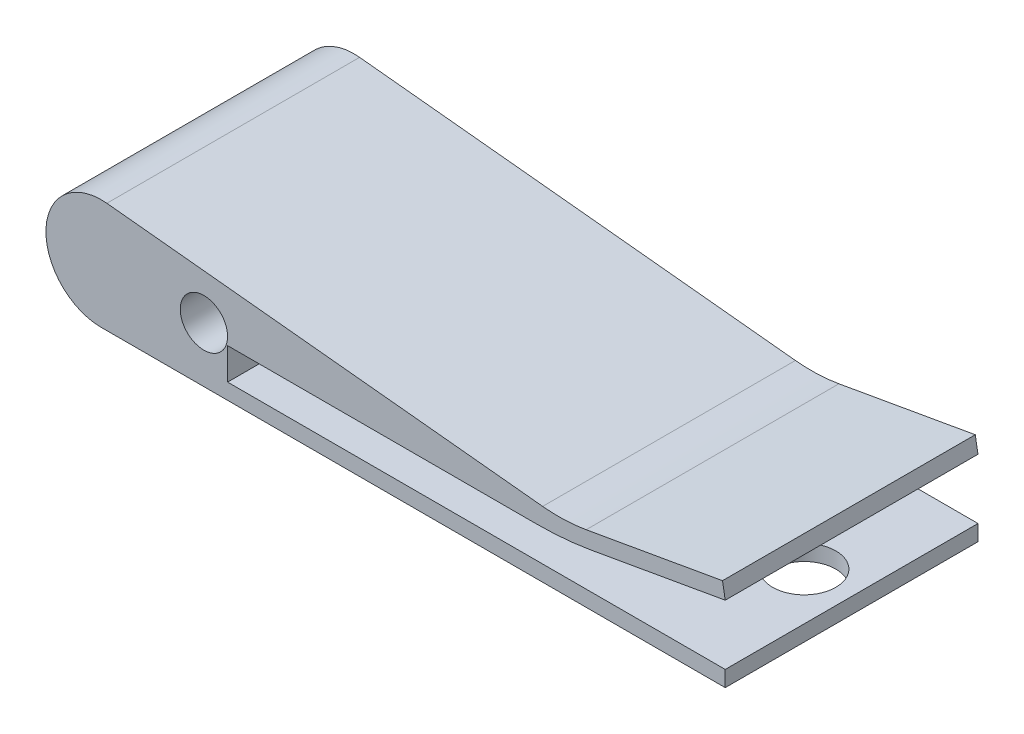
ISO-10303-21;
HEADER;
FILE_DESCRIPTION(('STEP AP214'),'2;1');
FILE_NAME('part.step','',(''),(''),'','','');
FILE_SCHEMA(('AUTOMOTIVE_DESIGN { 1 0 10303 214 1 1 1 1 }'));
ENDSEC;
DATA;
#1=APPLICATION_CONTEXT('core data for automotive mechanical design processes');
#2=APPLICATION_PROTOCOL_DEFINITION('international standard','automotive_design',2000,#1);
#3=PRODUCT_CONTEXT('',#1,'mechanical');
#4=PRODUCT('Part','Part','',(#3));
#5=PRODUCT_RELATED_PRODUCT_CATEGORY('part','',(#4));
#6=PRODUCT_DEFINITION_FORMATION('','',#4);
#7=PRODUCT_DEFINITION_CONTEXT('part definition',#1,'design');
#8=PRODUCT_DEFINITION('design','',#6,#7);
#9=PRODUCT_DEFINITION_SHAPE('','',#8);
#10=(LENGTH_UNIT() NAMED_UNIT(*) SI_UNIT(.MILLI.,.METRE.));
#11=(NAMED_UNIT(*) PLANE_ANGLE_UNIT() SI_UNIT($,.RADIAN.));
#12=(NAMED_UNIT(*) SI_UNIT($,.STERADIAN.) SOLID_ANGLE_UNIT());
#13=UNCERTAINTY_MEASURE_WITH_UNIT(LENGTH_MEASURE(1.E-05),#10,'distance_accuracy_value','');
#14=(GEOMETRIC_REPRESENTATION_CONTEXT(3) GLOBAL_UNCERTAINTY_ASSIGNED_CONTEXT((#13)) GLOBAL_UNIT_ASSIGNED_CONTEXT((#10,
#11,#12)) REPRESENTATION_CONTEXT('',''));
#15=CARTESIAN_POINT('',(0.,0.,0.));
#16=DIRECTION('',(0.,0.,1.));
#17=DIRECTION('',(1.,0.,0.));
#18=AXIS2_PLACEMENT_3D('',#15,#16,#17);
#19=CARTESIAN_POINT('',(11.5,0.,16.));
#20=DIRECTION('',(1.,0.,0.));
#21=DIRECTION('',(0.,0.,-1.));
#22=AXIS2_PLACEMENT_3D('',#19,#20,#21);
#23=PLANE('',#22);
#24=DIRECTION('',(0.,-1.,0.));
#25=VECTOR('',#24,1.);
#26=CARTESIAN_POINT('',(11.5,0.,0.));
#27=LINE('',#26,#25);
#28=CARTESIAN_POINT('',(11.5,3.00000000000025,0.));
#29=VERTEX_POINT('',#28);
#30=CARTESIAN_POINT('',(11.5,0.999999999999999,0.));
#31=VERTEX_POINT('',#30);
#32=EDGE_CURVE('E192',#29,#31,#27,.T.);
#33=ORIENTED_EDGE('',*,*,#32,.F.);
#34=DIRECTION('',(0.,0.,-1.));
#35=VECTOR('',#34,1.);
#36=CARTESIAN_POINT('',(11.5,3.00000000000025,16.));
#37=LINE('',#36,#35);
#38=CARTESIAN_POINT('',(11.5,3.00000000000025,16.));
#39=VERTEX_POINT('',#38);
#40=EDGE_CURVE('E181',#39,#29,#37,.T.);
#41=ORIENTED_EDGE('',*,*,#40,.F.);
#42=DIRECTION('',(0.,-1.,0.));
#43=VECTOR('',#42,1.);
#44=CARTESIAN_POINT('',(11.5,0.,16.));
#45=LINE('',#44,#43);
#46=CARTESIAN_POINT('',(11.5,0.999999999999999,16.));
#47=VERTEX_POINT('',#46);
#48=EDGE_CURVE('E186',#39,#47,#45,.T.);
#49=ORIENTED_EDGE('',*,*,#48,.T.);
#50=DIRECTION('',(0.,0.,-1.));
#51=VECTOR('',#50,1.);
#52=CARTESIAN_POINT('',(11.5,0.999999999999999,16.));
#53=LINE('',#52,#51);
#54=EDGE_CURVE('E169',#47,#31,#53,.T.);
#55=ORIENTED_EDGE('',*,*,#54,.T.);
#56=EDGE_LOOP('',(#33,#41,#49,#55));
#57=FACE_BOUND('',#56,.T.);
#58=ADVANCED_FACE('F81',(#57),#23,.T.);
#59=CARTESIAN_POINT('',(0.,0.,0.));
#60=DIRECTION('',(0.,0.,1.));
#61=DIRECTION('',(1.,0.,0.));
#62=AXIS2_PLACEMENT_3D('',#59,#60,#61);
#63=PLANE('',#62);
#64=CARTESIAN_POINT('',(10.,3.5,0.));
#65=DIRECTION('',(0.,0.,1.));
#66=DIRECTION('',(1.,0.,0.));
#67=AXIS2_PLACEMENT_3D('',#64,#65,#66);
#68=CIRCLE('',#67,1.5);
#69=CARTESIAN_POINT('',(11.5,3.5,0.));
#70=VERTEX_POINT('',#69);
#71=EDGE_CURVE('E221',#70,#70,#68,.T.);
#72=ORIENTED_EDGE('',*,*,#71,.T.);
#73=EDGE_LOOP('',(#72));
#74=FACE_BOUND('',#73,.T.);
#75=DIRECTION('',(0.984807753012209,0.173648177666928,0.));
#76=VECTOR('',#75,1.);
#77=CARTESIAN_POINT('',(32.8263518223331,3.00000000000025,0.));
#78=LINE('',#77,#76);
#79=CARTESIAN_POINT('',(34.5495421051532,3.30384493975608,0.));
#80=VERTEX_POINT('',#79);
#81=CARTESIAN_POINT('',(43.,4.79388866595841,0.));
#82=VERTEX_POINT('',#81);
#83=EDGE_CURVE('E225',#80,#82,#78,.T.);
#84=ORIENTED_EDGE('',*,*,#83,.F.);
#85=CARTESIAN_POINT('',(31.0765785518146,23.0000000000002,0.));
#86=DIRECTION('',(0.,0.,1.));
#87=DIRECTION('',(1.,0.,0.));
#88=AXIS2_PLACEMENT_3D('',#85,#86,#87);
#89=CIRCLE('',#88,20.);
#90=CARTESIAN_POINT('',(31.0765785518146,3.00000000000025,0.));
#91=VERTEX_POINT('',#90);
#92=EDGE_CURVE('E103',#80,#91,#89,.F.);
#93=ORIENTED_EDGE('',*,*,#92,.T.);
#94=DIRECTION('',(1.,0.,0.));
#95=VECTOR('',#94,1.);
#96=CARTESIAN_POINT('',(6.96410161513779,3.00000000000025,0.));
#97=LINE('',#96,#95);
#98=EDGE_CURVE('E223',#29,#91,#97,.T.);
#99=ORIENTED_EDGE('',*,*,#98,.F.);
#100=ORIENTED_EDGE('',*,*,#32,.T.);
#101=DIRECTION('',(-1.,0.,0.));
#102=VECTOR('',#101,1.);
#103=CARTESIAN_POINT('',(43.,1.00000000000006,0.));
#104=LINE('',#103,#102);
#105=CARTESIAN_POINT('',(43.,1.00000000000006,0.));
#106=VERTEX_POINT('',#105);
#107=EDGE_CURVE('E175',#106,#31,#104,.T.);
#108=ORIENTED_EDGE('',*,*,#107,.F.);
#109=DIRECTION('',(0.,1.,0.));
#110=VECTOR('',#109,1.);
#111=CARTESIAN_POINT('',(43.,0.,0.));
#112=LINE('',#111,#110);
#113=CARTESIAN_POINT('',(43.,0.,0.));
#114=VERTEX_POINT('',#113);
#115=EDGE_CURVE('E218',#114,#106,#112,.T.);
#116=ORIENTED_EDGE('',*,*,#115,.F.);
#117=DIRECTION('',(1.,0.,0.));
#118=VECTOR('',#117,1.);
#119=CARTESIAN_POINT('',(3.5,0.,0.));
#120=LINE('',#119,#118);
#121=CARTESIAN_POINT('',(3.5,0.,0.));
#122=VERTEX_POINT('',#121);
#123=EDGE_CURVE('E201',#122,#114,#120,.T.);
#124=ORIENTED_EDGE('',*,*,#123,.F.);
#125=CARTESIAN_POINT('',(3.5,3.5,0.));
#126=DIRECTION('',(0.,0.,1.));
#127=DIRECTION('',(1.,0.,0.));
#128=AXIS2_PLACEMENT_3D('',#125,#126,#127);
#129=CIRCLE('',#128,3.5);
#130=CARTESIAN_POINT('',(3.85651861531159,6.9817947206773,0.));
#131=VERTEX_POINT('',#130);
#132=EDGE_CURVE('E234',#131,#122,#129,.T.);
#133=ORIENTED_EDGE('',*,*,#132,.F.);
#134=DIRECTION('',(-0.994798491622085,0.101862461517598,0.));
#135=VECTOR('',#134,1.);
#136=CARTESIAN_POINT('',(32.8263518223331,4.015426611886,0.));
#137=LINE('',#136,#135);
#138=CARTESIAN_POINT('',(31.4418463479263,4.1571931473154,0.));
#139=VERTEX_POINT('',#138);
#140=EDGE_CURVE('E232',#139,#131,#137,.T.);
#141=ORIENTED_EDGE('',*,*,#140,.F.);
#142=CARTESIAN_POINT('',(32.4604709631023,14.1051780635363,0.));
#143=DIRECTION('',(0.,0.,1.));
#144=DIRECTION('',(1.,0.,0.));
#145=AXIS2_PLACEMENT_3D('',#142,#143,#144);
#146=CIRCLE('',#145,10.);
#147=CARTESIAN_POINT('',(34.1969527397716,4.25710053341417,0.));
#148=VERTEX_POINT('',#147);
#149=EDGE_CURVE('E256',#139,#148,#146,.T.);
#150=ORIENTED_EDGE('',*,*,#149,.T.);
#151=DIRECTION('',(-0.984807753012209,-0.173648177666928,0.));
#152=VECTOR('',#151,1.);
#153=CARTESIAN_POINT('',(42.8263518223331,5.77869641897062,0.));
#154=LINE('',#153,#152);
#155=CARTESIAN_POINT('',(42.8263518223331,5.77869641897062,0.));
#156=VERTEX_POINT('',#155);
#157=EDGE_CURVE('E229',#156,#148,#154,.T.);
#158=ORIENTED_EDGE('',*,*,#157,.F.);
#159=DIRECTION('',(-0.173648177666928,0.984807753012208,0.));
#160=VECTOR('',#159,1.);
#161=CARTESIAN_POINT('',(43.,4.79388866595841,0.));
#162=LINE('',#161,#160);
#163=EDGE_CURVE('E227',#82,#156,#162,.T.);
#164=ORIENTED_EDGE('',*,*,#163,.F.);
#165=EDGE_LOOP('',(#84,#93,#99,#100,#108,#116,#124,#133,#141,#150,#158,#164));
#166=FACE_BOUND('',#165,.T.);
#167=ADVANCED_FACE('F271',(#74,#166),#63,.F.);
#168=CARTESIAN_POINT('',(0.,0.,16.));
#169=DIRECTION('',(0.,0.,1.));
#170=DIRECTION('',(1.,0.,0.));
#171=AXIS2_PLACEMENT_3D('',#168,#169,#170);
#172=PLANE('',#171);
#173=CARTESIAN_POINT('',(10.,3.5,16.));
#174=DIRECTION('',(0.,0.,1.));
#175=DIRECTION('',(1.,0.,0.));
#176=AXIS2_PLACEMENT_3D('',#173,#174,#175);
#177=CIRCLE('',#176,1.5);
#178=CARTESIAN_POINT('',(11.5,3.5,16.));
#179=VERTEX_POINT('',#178);
#180=EDGE_CURVE('E198',#179,#179,#177,.T.);
#181=ORIENTED_EDGE('',*,*,#180,.F.);
#182=EDGE_LOOP('',(#181));
#183=FACE_BOUND('',#182,.T.);
#184=DIRECTION('',(1.,0.,0.));
#185=VECTOR('',#184,1.);
#186=CARTESIAN_POINT('',(6.96410161513779,3.00000000000025,16.));
#187=LINE('',#186,#185);
#188=CARTESIAN_POINT('',(31.0765785518146,3.00000000000025,16.));
#189=VERTEX_POINT('',#188);
#190=EDGE_CURVE('E190',#39,#189,#187,.T.);
#191=ORIENTED_EDGE('',*,*,#190,.T.);
#192=CARTESIAN_POINT('',(31.0765785518146,23.0000000000002,16.));
#193=DIRECTION('',(0.,0.,1.));
#194=DIRECTION('',(1.,0.,0.));
#195=AXIS2_PLACEMENT_3D('',#192,#193,#194);
#196=CIRCLE('',#195,20.);
#197=CARTESIAN_POINT('',(34.5495421051532,3.30384493975608,16.));
#198=VERTEX_POINT('',#197);
#199=EDGE_CURVE('E12',#189,#198,#196,.T.);
#200=ORIENTED_EDGE('',*,*,#199,.T.);
#201=DIRECTION('',(0.984807753012209,0.173648177666928,0.));
#202=VECTOR('',#201,1.);
#203=CARTESIAN_POINT('',(32.8263518223331,3.00000000000025,16.));
#204=LINE('',#203,#202);
#205=CARTESIAN_POINT('',(43.,4.79388866595841,16.));
#206=VERTEX_POINT('',#205);
#207=EDGE_CURVE('E204',#198,#206,#204,.T.);
#208=ORIENTED_EDGE('',*,*,#207,.T.);
#209=DIRECTION('',(-0.173648177666928,0.984807753012208,0.));
#210=VECTOR('',#209,1.);
#211=CARTESIAN_POINT('',(43.,4.79388866595841,16.));
#212=LINE('',#211,#210);
#213=CARTESIAN_POINT('',(42.8263518223331,5.77869641897062,16.));
#214=VERTEX_POINT('',#213);
#215=EDGE_CURVE('E206',#206,#214,#212,.T.);
#216=ORIENTED_EDGE('',*,*,#215,.T.);
#217=DIRECTION('',(-0.984807753012209,-0.173648177666928,0.));
#218=VECTOR('',#217,1.);
#219=CARTESIAN_POINT('',(42.8263518223331,5.77869641897062,16.));
#220=LINE('',#219,#218);
#221=CARTESIAN_POINT('',(34.1969527397716,4.25710053341417,16.));
#222=VERTEX_POINT('',#221);
#223=EDGE_CURVE('E208',#214,#222,#220,.T.);
#224=ORIENTED_EDGE('',*,*,#223,.T.);
#225=CARTESIAN_POINT('',(32.4604709631023,14.1051780635363,16.));
#226=DIRECTION('',(0.,0.,1.));
#227=DIRECTION('',(1.,0.,0.));
#228=AXIS2_PLACEMENT_3D('',#225,#226,#227);
#229=CIRCLE('',#228,10.);
#230=CARTESIAN_POINT('',(31.4418463479263,4.1571931473154,16.));
#231=VERTEX_POINT('',#230);
#232=EDGE_CURVE('E258',#222,#231,#229,.F.);
#233=ORIENTED_EDGE('',*,*,#232,.T.);
#234=DIRECTION('',(-0.994798491622085,0.101862461517598,0.));
#235=VECTOR('',#234,1.);
#236=CARTESIAN_POINT('',(32.8263518223331,4.015426611886,16.));
#237=LINE('',#236,#235);
#238=CARTESIAN_POINT('',(3.85651861531159,6.9817947206773,16.));
#239=VERTEX_POINT('',#238);
#240=EDGE_CURVE('E211',#231,#239,#237,.T.);
#241=ORIENTED_EDGE('',*,*,#240,.T.);
#242=CARTESIAN_POINT('',(3.5,3.5,16.));
#243=DIRECTION('',(0.,0.,1.));
#244=DIRECTION('',(1.,0.,0.));
#245=AXIS2_PLACEMENT_3D('',#242,#243,#244);
#246=CIRCLE('',#245,3.5);
#247=CARTESIAN_POINT('',(3.5,0.,16.));
#248=VERTEX_POINT('',#247);
#249=EDGE_CURVE('E213',#239,#248,#246,.T.);
#250=ORIENTED_EDGE('',*,*,#249,.T.);
#251=DIRECTION('',(1.,0.,0.));
#252=VECTOR('',#251,1.);
#253=CARTESIAN_POINT('',(3.5,0.,16.));
#254=LINE('',#253,#252);
#255=CARTESIAN_POINT('',(43.,0.,16.));
#256=VERTEX_POINT('',#255);
#257=EDGE_CURVE('E215',#248,#256,#254,.T.);
#258=ORIENTED_EDGE('',*,*,#257,.T.);
#259=DIRECTION('',(0.,1.,0.));
#260=VECTOR('',#259,1.);
#261=CARTESIAN_POINT('',(43.,0.,16.));
#262=LINE('',#261,#260);
#263=CARTESIAN_POINT('',(43.,1.00000000000006,16.));
#264=VERTEX_POINT('',#263);
#265=EDGE_CURVE('E188',#256,#264,#262,.T.);
#266=ORIENTED_EDGE('',*,*,#265,.T.);
#267=DIRECTION('',(-1.,0.,0.));
#268=VECTOR('',#267,1.);
#269=CARTESIAN_POINT('',(43.,1.00000000000006,16.));
#270=LINE('',#269,#268);
#271=EDGE_CURVE('E173',#264,#47,#270,.T.);
#272=ORIENTED_EDGE('',*,*,#271,.T.);
#273=ORIENTED_EDGE('',*,*,#48,.F.);
#274=EDGE_LOOP('',(#191,#200,#208,#216,#224,#233,#241,#250,#258,#266,#272,#273));
#275=FACE_BOUND('',#274,.T.);
#276=ADVANCED_FACE('F185',(#183,#275),#172,.T.);
#277=CARTESIAN_POINT('',(43.,1.00000000000006,16.));
#278=DIRECTION('',(0.,-1.,0.));
#279=DIRECTION('',(1.,0.,0.));
#280=AXIS2_PLACEMENT_3D('',#277,#278,#279);
#281=PLANE('',#280);
#282=CARTESIAN_POINT('',(40.,1.00000000000006,8.));
#283=DIRECTION('',(0.,-1.,0.));
#284=DIRECTION('',(1.,0.,0.));
#285=AXIS2_PLACEMENT_3D('',#282,#283,#284);
#286=CIRCLE('',#285,2.);
#287=CARTESIAN_POINT('',(42.,1.00000000000006,8.));
#288=VERTEX_POINT('',#287);
#289=EDGE_CURVE('E485',#288,#288,#286,.T.);
#290=ORIENTED_EDGE('',*,*,#289,.T.);
#291=EDGE_LOOP('',(#290));
#292=FACE_BOUND('',#291,.T.);
#293=CARTESIAN_POINT('',(15.,1.00000000000002,8.));
#294=DIRECTION('',(0.,-1.,0.));
#295=DIRECTION('',(1.,0.,0.));
#296=AXIS2_PLACEMENT_3D('',#293,#294,#295);
#297=CIRCLE('',#296,2.);
#298=CARTESIAN_POINT('',(17.,1.00000000000002,8.));
#299=VERTEX_POINT('',#298);
#300=EDGE_CURVE('E493',#299,#299,#297,.T.);
#301=ORIENTED_EDGE('',*,*,#300,.T.);
#302=EDGE_LOOP('',(#301));
#303=FACE_BOUND('',#302,.T.);
#304=ORIENTED_EDGE('',*,*,#54,.F.);
#305=ORIENTED_EDGE('',*,*,#271,.F.);
#306=DIRECTION('',(0.,0.,-1.));
#307=VECTOR('',#306,1.);
#308=CARTESIAN_POINT('',(43.,1.00000000000006,16.));
#309=LINE('',#308,#307);
#310=EDGE_CURVE('E195',#264,#106,#309,.T.);
#311=ORIENTED_EDGE('',*,*,#310,.T.);
#312=ORIENTED_EDGE('',*,*,#107,.T.);
#313=EDGE_LOOP('',(#304,#305,#311,#312));
#314=FACE_BOUND('',#313,.T.);
#315=ADVANCED_FACE('F171',(#292,#303,#314),#281,.F.);
#316=CARTESIAN_POINT('',(6.96410161513779,3.00000000000025,16.));
#317=DIRECTION('',(0.,1.,0.));
#318=DIRECTION('',(-1.,0.,0.));
#319=AXIS2_PLACEMENT_3D('',#316,#317,#318);
#320=PLANE('',#319);
#321=ORIENTED_EDGE('',*,*,#98,.T.);
#322=DIRECTION('',(0.,0.,-1.));
#323=VECTOR('',#322,1.);
#324=CARTESIAN_POINT('',(31.0765785518146,3.00000000000025,16.));
#325=LINE('',#324,#323);
#326=EDGE_CURVE('E89',#91,#189,#325,.F.);
#327=ORIENTED_EDGE('',*,*,#326,.T.);
#328=ORIENTED_EDGE('',*,*,#190,.F.);
#329=ORIENTED_EDGE('',*,*,#40,.T.);
#330=EDGE_LOOP('',(#321,#327,#328,#329));
#331=FACE_BOUND('',#330,.T.);
#332=ADVANCED_FACE('F303',(#331),#320,.F.);
#333=CARTESIAN_POINT('',(32.8263518223331,3.00000000000025,16.));
#334=DIRECTION('',(-0.173648177666928,0.984807753012208,0.));
#335=DIRECTION('',(-0.984807753012209,-0.173648177666928,0.));
#336=AXIS2_PLACEMENT_3D('',#333,#334,#335);
#337=PLANE('',#336);
#338=ORIENTED_EDGE('',*,*,#207,.F.);
#339=DIRECTION('',(0.,0.,-1.));
#340=VECTOR('',#339,1.);
#341=CARTESIAN_POINT('',(34.5495421051532,3.30384493975608,16.));
#342=LINE('',#341,#340);
#343=EDGE_CURVE('E260',#198,#80,#342,.T.);
#344=ORIENTED_EDGE('',*,*,#343,.T.);
#345=ORIENTED_EDGE('',*,*,#83,.T.);
#346=DIRECTION('',(0.,0.,-1.));
#347=VECTOR('',#346,1.);
#348=CARTESIAN_POINT('',(43.,4.79388866595841,16.));
#349=LINE('',#348,#347);
#350=EDGE_CURVE('E248',#206,#82,#349,.T.);
#351=ORIENTED_EDGE('',*,*,#350,.F.);
#352=EDGE_LOOP('',(#338,#344,#345,#351));
#353=FACE_BOUND('',#352,.T.);
#354=ADVANCED_FACE('F266',(#353),#337,.F.);
#355=CARTESIAN_POINT('',(43.,4.79388866595841,16.));
#356=DIRECTION('',(-0.984807753012208,-0.173648177666928,0.));
#357=DIRECTION('',(0.173648177666928,-0.984807753012208,0.));
#358=AXIS2_PLACEMENT_3D('',#355,#356,#357);
#359=PLANE('',#358);
#360=ORIENTED_EDGE('',*,*,#163,.T.);
#361=DIRECTION('',(0.,0.,-1.));
#362=VECTOR('',#361,1.);
#363=CARTESIAN_POINT('',(42.8263518223331,5.77869641897062,16.));
#364=LINE('',#363,#362);
#365=EDGE_CURVE('E245',#214,#156,#364,.T.);
#366=ORIENTED_EDGE('',*,*,#365,.F.);
#367=ORIENTED_EDGE('',*,*,#215,.F.);
#368=ORIENTED_EDGE('',*,*,#350,.T.);
#369=EDGE_LOOP('',(#360,#366,#367,#368));
#370=FACE_BOUND('',#369,.T.);
#371=ADVANCED_FACE('F275',(#370),#359,.F.);
#372=CARTESIAN_POINT('',(42.8263518223331,5.77869641897062,16.));
#373=DIRECTION('',(0.173648177666928,-0.984807753012208,0.));
#374=DIRECTION('',(0.984807753012209,0.173648177666928,0.));
#375=AXIS2_PLACEMENT_3D('',#372,#373,#374);
#376=PLANE('',#375);
#377=ORIENTED_EDGE('',*,*,#157,.T.);
#378=DIRECTION('',(0.,0.,-1.));
#379=VECTOR('',#378,1.);
#380=CARTESIAN_POINT('',(34.1969527397716,4.25710053341417,16.));
#381=LINE('',#380,#379);
#382=EDGE_CURVE('E254',#148,#222,#381,.F.);
#383=ORIENTED_EDGE('',*,*,#382,.T.);
#384=ORIENTED_EDGE('',*,*,#223,.F.);
#385=ORIENTED_EDGE('',*,*,#365,.T.);
#386=EDGE_LOOP('',(#377,#383,#384,#385));
#387=FACE_BOUND('',#386,.T.);
#388=ADVANCED_FACE('F279',(#387),#376,.F.);
#389=CARTESIAN_POINT('',(32.8263518223331,4.015426611886,16.));
#390=DIRECTION('',(-0.101862461517598,-0.994798491622085,0.));
#391=DIRECTION('',(0.994798491622085,-0.101862461517598,0.));
#392=AXIS2_PLACEMENT_3D('',#389,#390,#391);
#393=PLANE('',#392);
#394=ORIENTED_EDGE('',*,*,#240,.F.);
#395=DIRECTION('',(0.,0.,-1.));
#396=VECTOR('',#395,1.);
#397=CARTESIAN_POINT('',(31.4418463479263,4.1571931473154,0.));
#398=LINE('',#397,#396);
#399=EDGE_CURVE('E180',#231,#139,#398,.T.);
#400=ORIENTED_EDGE('',*,*,#399,.T.);
#401=ORIENTED_EDGE('',*,*,#140,.T.);
#402=DIRECTION('',(0.,0.,-1.));
#403=VECTOR('',#402,1.);
#404=CARTESIAN_POINT('',(3.85651861531159,6.9817947206773,16.));
#405=LINE('',#404,#403);
#406=EDGE_CURVE('E242',#239,#131,#405,.T.);
#407=ORIENTED_EDGE('',*,*,#406,.F.);
#408=EDGE_LOOP('',(#394,#400,#401,#407));
#409=FACE_BOUND('',#408,.T.);
#410=ADVANCED_FACE('F288',(#409),#393,.F.);
#411=CARTESIAN_POINT('',(3.5,3.5,16.));
#412=DIRECTION('',(0.,0.,-1.));
#413=DIRECTION('',(-1.,0.,0.));
#414=AXIS2_PLACEMENT_3D('',#411,#412,#413);
#415=CYLINDRICAL_SURFACE('',#414,3.5);
#416=ORIENTED_EDGE('',*,*,#132,.T.);
#417=DIRECTION('',(0.,0.,-1.));
#418=VECTOR('',#417,1.);
#419=CARTESIAN_POINT('',(3.5,0.,16.));
#420=LINE('',#419,#418);
#421=EDGE_CURVE('E239',#248,#122,#420,.T.);
#422=ORIENTED_EDGE('',*,*,#421,.F.);
#423=ORIENTED_EDGE('',*,*,#249,.F.);
#424=ORIENTED_EDGE('',*,*,#406,.T.);
#425=EDGE_LOOP('',(#416,#422,#423,#424));
#426=FACE_BOUND('',#425,.T.);
#427=ADVANCED_FACE('F295',(#426),#415,.T.);
#428=CARTESIAN_POINT('',(3.5,0.,16.));
#429=DIRECTION('',(0.,1.,0.));
#430=DIRECTION('',(-1.,0.,0.));
#431=AXIS2_PLACEMENT_3D('',#428,#429,#430);
#432=PLANE('',#431);
#433=CARTESIAN_POINT('',(40.,0.,8.));
#434=DIRECTION('',(0.,-1.,0.));
#435=DIRECTION('',(1.,0.,0.));
#436=AXIS2_PLACEMENT_3D('',#433,#434,#435);
#437=CIRCLE('',#436,2.);
#438=CARTESIAN_POINT('',(42.,0.,8.));
#439=VERTEX_POINT('',#438);
#440=EDGE_CURVE('E488',#439,#439,#437,.T.);
#441=ORIENTED_EDGE('',*,*,#440,.F.);
#442=EDGE_LOOP('',(#441));
#443=FACE_BOUND('',#442,.T.);
#444=CARTESIAN_POINT('',(15.,0.,8.));
#445=DIRECTION('',(0.,-1.,0.));
#446=DIRECTION('',(1.,0.,0.));
#447=AXIS2_PLACEMENT_3D('',#444,#445,#446);
#448=CIRCLE('',#447,2.);
#449=CARTESIAN_POINT('',(17.,0.,8.));
#450=VERTEX_POINT('',#449);
#451=EDGE_CURVE('E489',#450,#450,#448,.T.);
#452=ORIENTED_EDGE('',*,*,#451,.F.);
#453=EDGE_LOOP('',(#452));
#454=FACE_BOUND('',#453,.T.);
#455=ORIENTED_EDGE('',*,*,#123,.T.);
#456=DIRECTION('',(0.,0.,-1.));
#457=VECTOR('',#456,1.);
#458=CARTESIAN_POINT('',(43.,0.,16.));
#459=LINE('',#458,#457);
#460=EDGE_CURVE('E217',#256,#114,#459,.T.);
#461=ORIENTED_EDGE('',*,*,#460,.F.);
#462=ORIENTED_EDGE('',*,*,#257,.F.);
#463=ORIENTED_EDGE('',*,*,#421,.T.);
#464=EDGE_LOOP('',(#455,#461,#462,#463));
#465=FACE_BOUND('',#464,.T.);
#466=ADVANCED_FACE('F299',(#443,#454,#465),#432,.F.);
#467=CARTESIAN_POINT('',(43.,0.,16.));
#468=DIRECTION('',(-1.,0.,0.));
#469=DIRECTION('',(0.,0.,1.));
#470=AXIS2_PLACEMENT_3D('',#467,#468,#469);
#471=PLANE('',#470);
#472=ORIENTED_EDGE('',*,*,#115,.T.);
#473=ORIENTED_EDGE('',*,*,#310,.F.);
#474=ORIENTED_EDGE('',*,*,#265,.F.);
#475=ORIENTED_EDGE('',*,*,#460,.T.);
#476=EDGE_LOOP('',(#472,#473,#474,#475));
#477=FACE_BOUND('',#476,.T.);
#478=ADVANCED_FACE('F302',(#477),#471,.F.);
#479=CARTESIAN_POINT('',(32.4604709631023,14.1051780635363,16.));
#480=DIRECTION('',(0.,0.,1.));
#481=DIRECTION('',(1.,0.,0.));
#482=AXIS2_PLACEMENT_3D('',#479,#480,#481);
#483=CYLINDRICAL_SURFACE('',#482,10.);
#484=ORIENTED_EDGE('',*,*,#232,.F.);
#485=ORIENTED_EDGE('',*,*,#382,.F.);
#486=ORIENTED_EDGE('',*,*,#149,.F.);
#487=ORIENTED_EDGE('',*,*,#399,.F.);
#488=EDGE_LOOP('',(#484,#485,#486,#487));
#489=FACE_BOUND('',#488,.T.);
#490=ADVANCED_FACE('F285',(#489),#483,.F.);
#491=CARTESIAN_POINT('',(31.0765785518146,23.0000000000002,16.));
#492=DIRECTION('',(0.,0.,-1.));
#493=DIRECTION('',(-1.,0.,0.));
#494=AXIS2_PLACEMENT_3D('',#491,#492,#493);
#495=CYLINDRICAL_SURFACE('',#494,20.);
#496=ORIENTED_EDGE('',*,*,#199,.F.);
#497=ORIENTED_EDGE('',*,*,#326,.F.);
#498=ORIENTED_EDGE('',*,*,#92,.F.);
#499=ORIENTED_EDGE('',*,*,#343,.F.);
#500=EDGE_LOOP('',(#496,#497,#498,#499));
#501=FACE_BOUND('',#500,.T.);
#502=ADVANCED_FACE('F83',(#501),#495,.T.);
#503=CARTESIAN_POINT('',(10.,3.5,0.));
#504=DIRECTION('',(0.,0.,1.));
#505=DIRECTION('',(1.,0.,0.));
#506=AXIS2_PLACEMENT_3D('',#503,#504,#505);
#507=CYLINDRICAL_SURFACE('',#506,1.5);
#508=ORIENTED_EDGE('',*,*,#71,.F.);
#509=EDGE_LOOP('',(#508));
#510=FACE_BOUND('',#509,.T.);
#511=ORIENTED_EDGE('',*,*,#180,.T.);
#512=EDGE_LOOP('',(#511));
#513=FACE_BOUND('',#512,.T.);
#514=ADVANCED_FACE('F305',(#510,#513),#507,.F.);
#515=CARTESIAN_POINT('',(15.,1.00000000000002,8.));
#516=DIRECTION('',(0.,-1.,0.));
#517=DIRECTION('',(1.,0.,0.));
#518=AXIS2_PLACEMENT_3D('',#515,#516,#517);
#519=CYLINDRICAL_SURFACE('',#518,2.);
#520=ORIENTED_EDGE('',*,*,#300,.F.);
#521=EDGE_LOOP('',(#520));
#522=FACE_BOUND('',#521,.T.);
#523=ORIENTED_EDGE('',*,*,#451,.T.);
#524=EDGE_LOOP('',(#523));
#525=FACE_BOUND('',#524,.T.);
#526=ADVANCED_FACE('F310',(#522,#525),#519,.F.);
#527=CARTESIAN_POINT('',(40.,1.00000000000006,8.));
#528=DIRECTION('',(0.,-1.,0.));
#529=DIRECTION('',(1.,0.,0.));
#530=AXIS2_PLACEMENT_3D('',#527,#528,#529);
#531=CYLINDRICAL_SURFACE('',#530,2.);
#532=ORIENTED_EDGE('',*,*,#289,.F.);
#533=EDGE_LOOP('',(#532));
#534=FACE_BOUND('',#533,.T.);
#535=ORIENTED_EDGE('',*,*,#440,.T.);
#536=EDGE_LOOP('',(#535));
#537=FACE_BOUND('',#536,.T.);
#538=ADVANCED_FACE('F421',(#534,#537),#531,.F.);
#539=CLOSED_SHELL('',(#58,#167,#276,#315,#332,#354,#371,#388,#410,#427,#466,#478,#490,#502,#514,
#526,#538));
#540=MANIFOLD_SOLID_BREP('B2',#539);
#541=ADVANCED_BREP_SHAPE_REPRESENTATION('',(#18,#540),#14);
#542=SHAPE_DEFINITION_REPRESENTATION(#9,#541);
ENDSEC;
END-ISO-10303-21;
